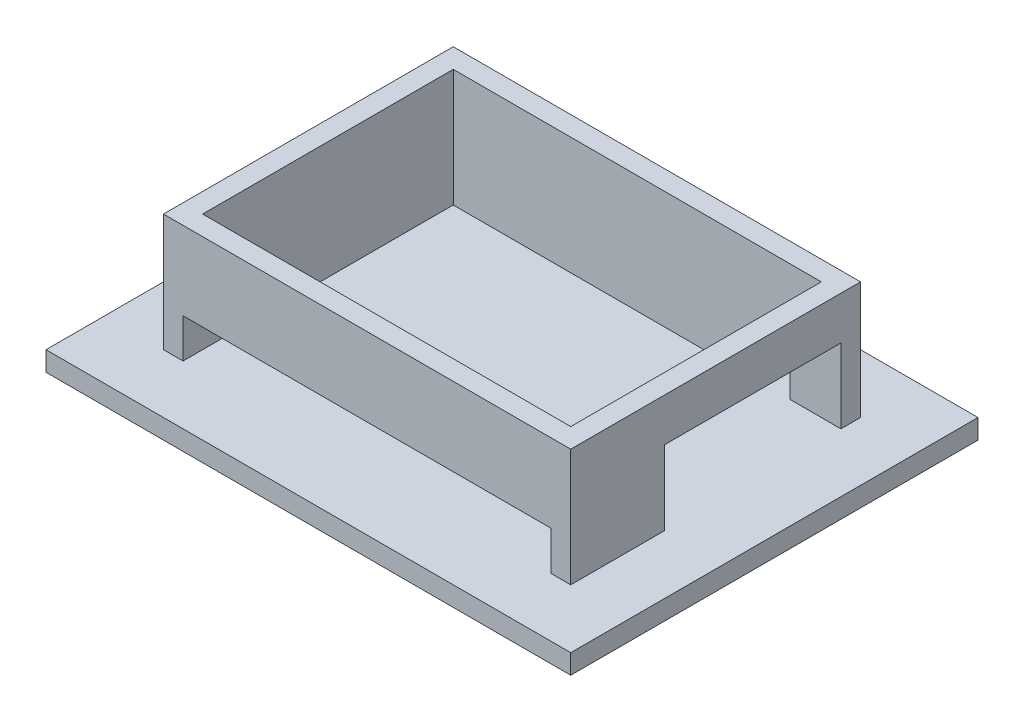
ISO-10303-21;
HEADER;
FILE_DESCRIPTION(('STEP AP214'),'2;1');
FILE_NAME('part.step','',(''),(''),'','','');
FILE_SCHEMA(('AUTOMOTIVE_DESIGN { 1 0 10303 214 1 1 1 1 }'));
ENDSEC;
DATA;
#1=APPLICATION_CONTEXT('core data for automotive mechanical design processes');
#2=APPLICATION_PROTOCOL_DEFINITION('international standard','automotive_design',2000,#1);
#3=PRODUCT_CONTEXT('',#1,'mechanical');
#4=PRODUCT('Part','Part','',(#3));
#5=PRODUCT_RELATED_PRODUCT_CATEGORY('part','',(#4));
#6=PRODUCT_DEFINITION_FORMATION('','',#4);
#7=PRODUCT_DEFINITION_CONTEXT('part definition',#1,'design');
#8=PRODUCT_DEFINITION('design','',#6,#7);
#9=PRODUCT_DEFINITION_SHAPE('','',#8);
#10=(LENGTH_UNIT() NAMED_UNIT(*) SI_UNIT(.MILLI.,.METRE.));
#11=(NAMED_UNIT(*) PLANE_ANGLE_UNIT() SI_UNIT($,.RADIAN.));
#12=(NAMED_UNIT(*) SI_UNIT($,.STERADIAN.) SOLID_ANGLE_UNIT());
#13=UNCERTAINTY_MEASURE_WITH_UNIT(LENGTH_MEASURE(1.E-05),#10,'distance_accuracy_value','');
#14=(GEOMETRIC_REPRESENTATION_CONTEXT(3) GLOBAL_UNCERTAINTY_ASSIGNED_CONTEXT((#13)) GLOBAL_UNIT_ASSIGNED_CONTEXT((#10,
#11,#12)) REPRESENTATION_CONTEXT('',''));
#15=CARTESIAN_POINT('',(0.,0.,0.));
#16=DIRECTION('',(0.,0.,1.));
#17=DIRECTION('',(1.,0.,0.));
#18=AXIS2_PLACEMENT_3D('',#15,#16,#17);
#19=CARTESIAN_POINT('',(47.,35.,-32.));
#20=DIRECTION('',(0.,0.,1.));
#21=DIRECTION('',(1.,0.,0.));
#22=AXIS2_PLACEMENT_3D('',#19,#20,#21);
#23=PLANE('',#22);
#24=DIRECTION('',(-1.,0.,0.));
#25=VECTOR('',#24,1.);
#26=CARTESIAN_POINT('',(47.,5.,-32.));
#27=LINE('',#26,#25);
#28=CARTESIAN_POINT('',(27.,5.,-32.));
#29=VERTEX_POINT('',#28);
#30=CARTESIAN_POINT('',(-47.,5.,-32.));
#31=VERTEX_POINT('',#30);
#32=EDGE_CURVE('E317',#29,#31,#27,.T.);
#33=ORIENTED_EDGE('',*,*,#32,.F.);
#34=DIRECTION('',(0.,1.,0.));
#35=VECTOR('',#34,1.);
#36=CARTESIAN_POINT('',(27.,35.,-32.));
#37=LINE('',#36,#35);
#38=CARTESIAN_POINT('',(27.,11.,-32.));
#39=VERTEX_POINT('',#38);
#40=EDGE_CURVE('E235',#29,#39,#37,.T.);
#41=ORIENTED_EDGE('',*,*,#40,.T.);
#42=DIRECTION('',(1.,0.,0.));
#43=VECTOR('',#42,1.);
#44=CARTESIAN_POINT('',(47.,11.,-32.));
#45=LINE('',#44,#43);
#46=CARTESIAN_POINT('',(39.,11.,-32.));
#47=VERTEX_POINT('',#46);
#48=EDGE_CURVE('E231',#39,#47,#45,.T.);
#49=ORIENTED_EDGE('',*,*,#48,.T.);
#50=DIRECTION('',(0.,1.,0.));
#51=VECTOR('',#50,1.);
#52=CARTESIAN_POINT('',(39.,35.,-32.));
#53=LINE('',#52,#51);
#54=CARTESIAN_POINT('',(39.,5.,-32.));
#55=VERTEX_POINT('',#54);
#56=EDGE_CURVE('E212',#55,#47,#53,.T.);
#57=ORIENTED_EDGE('',*,*,#56,.F.);
#58=CARTESIAN_POINT('',(52.,5.,-32.));
#59=VERTEX_POINT('',#58);
#60=EDGE_CURVE('E318',#59,#55,#27,.T.);
#61=ORIENTED_EDGE('',*,*,#60,.F.);
#62=DIRECTION('',(0.,1.,0.));
#63=VECTOR('',#62,1.);
#64=CARTESIAN_POINT('',(52.,-169.62311163282,-32.));
#65=LINE('',#64,#63);
#66=CARTESIAN_POINT('',(52.,24.,-32.));
#67=VERTEX_POINT('',#66);
#68=EDGE_CURVE('E268',#59,#67,#65,.T.);
#69=ORIENTED_EDGE('',*,*,#68,.T.);
#70=DIRECTION('',(1.,0.,0.));
#71=VECTOR('',#70,1.);
#72=CARTESIAN_POINT('',(-95.8466989672793,24.,-32.));
#73=LINE('',#72,#71);
#74=CARTESIAN_POINT('',(47.,24.,-32.));
#75=VERTEX_POINT('',#74);
#76=EDGE_CURVE('E253',#75,#67,#73,.T.);
#77=ORIENTED_EDGE('',*,*,#76,.F.);
#78=DIRECTION('',(0.,-1.,0.));
#79=VECTOR('',#78,1.);
#80=CARTESIAN_POINT('',(47.,35.,-32.));
#81=LINE('',#80,#79);
#82=CARTESIAN_POINT('',(47.,35.,-32.));
#83=VERTEX_POINT('',#82);
#84=EDGE_CURVE('E339',#83,#75,#81,.T.);
#85=ORIENTED_EDGE('',*,*,#84,.F.);
#86=DIRECTION('',(-1.,0.,0.));
#87=VECTOR('',#86,1.);
#88=CARTESIAN_POINT('',(47.,35.,-32.));
#89=LINE('',#88,#87);
#90=CARTESIAN_POINT('',(-47.,35.,-32.));
#91=VERTEX_POINT('',#90);
#92=EDGE_CURVE('E328',#83,#91,#89,.T.);
#93=ORIENTED_EDGE('',*,*,#92,.T.);
#94=DIRECTION('',(0.,-1.,0.));
#95=VECTOR('',#94,1.);
#96=CARTESIAN_POINT('',(-47.,35.,-32.));
#97=LINE('',#96,#95);
#98=EDGE_CURVE('E342',#91,#31,#97,.T.);
#99=ORIENTED_EDGE('',*,*,#98,.T.);
#100=EDGE_LOOP('',(#33,#41,#49,#57,#61,#69,#77,#85,#93,#99));
#101=FACE_BOUND('',#100,.T.);
#102=ADVANCED_FACE('F64',(#101),#23,.T.);
#103=CARTESIAN_POINT('',(0.,-169.62311163282,-37.));
#104=DIRECTION('',(0.,0.,-1.));
#105=DIRECTION('',(-1.,0.,0.));
#106=AXIS2_PLACEMENT_3D('',#103,#104,#105);
#107=PLANE('',#106);
#108=DIRECTION('',(-1.,0.,0.));
#109=VECTOR('',#108,1.);
#110=CARTESIAN_POINT('',(0.,11.,-37.));
#111=LINE('',#110,#109);
#112=CARTESIAN_POINT('',(39.,11.,-37.));
#113=VERTEX_POINT('',#112);
#114=CARTESIAN_POINT('',(27.,11.,-37.));
#115=VERTEX_POINT('',#114);
#116=EDGE_CURVE('E218',#113,#115,#111,.T.);
#117=ORIENTED_EDGE('',*,*,#116,.T.);
#118=DIRECTION('',(0.,-1.,0.));
#119=VECTOR('',#118,1.);
#120=CARTESIAN_POINT('',(27.,0.,-37.));
#121=LINE('',#120,#119);
#122=CARTESIAN_POINT('',(27.,5.,-37.));
#123=VERTEX_POINT('',#122);
#124=EDGE_CURVE('E87',#115,#123,#121,.T.);
#125=ORIENTED_EDGE('',*,*,#124,.T.);
#126=DIRECTION('',(-1.,0.,0.));
#127=VECTOR('',#126,1.);
#128=CARTESIAN_POINT('',(0.,5.,-37.));
#129=LINE('',#128,#127);
#130=CARTESIAN_POINT('',(-52.,5.,-37.));
#131=VERTEX_POINT('',#130);
#132=EDGE_CURVE('E280',#123,#131,#129,.T.);
#133=ORIENTED_EDGE('',*,*,#132,.T.);
#134=DIRECTION('',(0.,1.,0.));
#135=VECTOR('',#134,1.);
#136=CARTESIAN_POINT('',(-52.,-169.62311163282,-37.));
#137=LINE('',#136,#135);
#138=CARTESIAN_POINT('',(-52.,35.,-37.));
#139=VERTEX_POINT('',#138);
#140=EDGE_CURVE('E304',#131,#139,#137,.T.);
#141=ORIENTED_EDGE('',*,*,#140,.T.);
#142=DIRECTION('',(-1.,0.,0.));
#143=VECTOR('',#142,1.);
#144=CARTESIAN_POINT('',(0.,35.,-37.));
#145=LINE('',#144,#143);
#146=CARTESIAN_POINT('',(52.,35.,-37.));
#147=VERTEX_POINT('',#146);
#148=EDGE_CURVE('E296',#147,#139,#145,.T.);
#149=ORIENTED_EDGE('',*,*,#148,.F.);
#150=DIRECTION('',(0.,1.,0.));
#151=VECTOR('',#150,1.);
#152=CARTESIAN_POINT('',(52.,-169.62311163282,-37.));
#153=LINE('',#152,#151);
#154=CARTESIAN_POINT('',(52.,5.,-37.));
#155=VERTEX_POINT('',#154);
#156=EDGE_CURVE('E311',#155,#147,#153,.T.);
#157=ORIENTED_EDGE('',*,*,#156,.F.);
#158=CARTESIAN_POINT('',(39.,5.,-37.));
#159=VERTEX_POINT('',#158);
#160=EDGE_CURVE('E224',#155,#159,#129,.T.);
#161=ORIENTED_EDGE('',*,*,#160,.T.);
#162=DIRECTION('',(0.,-1.,0.));
#163=VECTOR('',#162,1.);
#164=CARTESIAN_POINT('',(39.,0.,-37.));
#165=LINE('',#164,#163);
#166=EDGE_CURVE('E209',#113,#159,#165,.T.);
#167=ORIENTED_EDGE('',*,*,#166,.F.);
#168=EDGE_LOOP('',(#117,#125,#133,#141,#149,#157,#161,#167));
#169=FACE_BOUND('',#168,.T.);
#170=ADVANCED_FACE('F222',(#169),#107,.T.);
#171=CARTESIAN_POINT('',(52.,-169.62311163282,0.));
#172=DIRECTION('',(-1.,0.,0.));
#173=DIRECTION('',(0.,0.,1.));
#174=AXIS2_PLACEMENT_3D('',#171,#172,#173);
#175=PLANE('',#174);
#176=ORIENTED_EDGE('',*,*,#68,.F.);
#177=DIRECTION('',(0.,0.,1.));
#178=VECTOR('',#177,1.);
#179=CARTESIAN_POINT('',(52.,5.,0.));
#180=LINE('',#179,#178);
#181=EDGE_CURVE('E283',#155,#59,#180,.T.);
#182=ORIENTED_EDGE('',*,*,#181,.F.);
#183=ORIENTED_EDGE('',*,*,#156,.T.);
#184=DIRECTION('',(0.,0.,1.));
#185=VECTOR('',#184,1.);
#186=CARTESIAN_POINT('',(52.,35.,0.));
#187=LINE('',#186,#185);
#188=CARTESIAN_POINT('',(52.,35.,37.));
#189=VERTEX_POINT('',#188);
#190=EDGE_CURVE('E299',#147,#189,#187,.T.);
#191=ORIENTED_EDGE('',*,*,#190,.T.);
#192=DIRECTION('',(0.,1.,0.));
#193=VECTOR('',#192,1.);
#194=CARTESIAN_POINT('',(52.,-169.62311163282,37.));
#195=LINE('',#194,#193);
#196=CARTESIAN_POINT('',(52.,5.,37.));
#197=VERTEX_POINT('',#196);
#198=EDGE_CURVE('E309',#197,#189,#195,.T.);
#199=ORIENTED_EDGE('',*,*,#198,.F.);
#200=CARTESIAN_POINT('',(52.,5.,13.));
#201=VERTEX_POINT('',#200);
#202=EDGE_CURVE('E282',#201,#197,#180,.T.);
#203=ORIENTED_EDGE('',*,*,#202,.F.);
#204=DIRECTION('',(0.,1.,0.));
#205=VECTOR('',#204,1.);
#206=CARTESIAN_POINT('',(52.,-169.62311163282,13.));
#207=LINE('',#206,#205);
#208=CARTESIAN_POINT('',(52.,24.,13.));
#209=VERTEX_POINT('',#208);
#210=EDGE_CURVE('E258',#201,#209,#207,.T.);
#211=ORIENTED_EDGE('',*,*,#210,.T.);
#212=DIRECTION('',(0.,0.,-1.));
#213=VECTOR('',#212,1.);
#214=CARTESIAN_POINT('',(52.,24.,0.));
#215=LINE('',#214,#213);
#216=EDGE_CURVE('E13',#209,#67,#215,.T.);
#217=ORIENTED_EDGE('',*,*,#216,.T.);
#218=EDGE_LOOP('',(#176,#182,#183,#191,#199,#203,#211,#217));
#219=FACE_BOUND('',#218,.T.);
#220=ADVANCED_FACE('F399',(#219),#175,.F.);
#221=CARTESIAN_POINT('',(0.,35.,0.));
#222=DIRECTION('',(0.,-1.,0.));
#223=DIRECTION('',(0.,0.,-1.));
#224=AXIS2_PLACEMENT_3D('',#221,#222,#223);
#225=PLANE('',#224);
#226=DIRECTION('',(0.,0.,1.));
#227=VECTOR('',#226,1.);
#228=CARTESIAN_POINT('',(47.,35.,-32.));
#229=LINE('',#228,#227);
#230=CARTESIAN_POINT('',(47.,35.,32.));
#231=VERTEX_POINT('',#230);
#232=EDGE_CURVE('E331',#83,#231,#229,.T.);
#233=ORIENTED_EDGE('',*,*,#232,.T.);
#234=DIRECTION('',(-1.,0.,0.));
#235=VECTOR('',#234,1.);
#236=CARTESIAN_POINT('',(47.,35.,32.));
#237=LINE('',#236,#235);
#238=CARTESIAN_POINT('',(-47.,35.,32.));
#239=VERTEX_POINT('',#238);
#240=EDGE_CURVE('E323',#231,#239,#237,.T.);
#241=ORIENTED_EDGE('',*,*,#240,.T.);
#242=DIRECTION('',(0.,0.,1.));
#243=VECTOR('',#242,1.);
#244=CARTESIAN_POINT('',(-47.,35.,-32.));
#245=LINE('',#244,#243);
#246=EDGE_CURVE('E326',#91,#239,#245,.T.);
#247=ORIENTED_EDGE('',*,*,#246,.F.);
#248=ORIENTED_EDGE('',*,*,#92,.F.);
#249=EDGE_LOOP('',(#233,#241,#247,#248));
#250=FACE_BOUND('',#249,.T.);
#251=ORIENTED_EDGE('',*,*,#148,.T.);
#252=DIRECTION('',(0.,0.,1.));
#253=VECTOR('',#252,1.);
#254=CARTESIAN_POINT('',(-52.,35.,0.));
#255=LINE('',#254,#253);
#256=CARTESIAN_POINT('',(-52.,35.,37.));
#257=VERTEX_POINT('',#256);
#258=EDGE_CURVE('E293',#139,#257,#255,.T.);
#259=ORIENTED_EDGE('',*,*,#258,.T.);
#260=DIRECTION('',(-1.,0.,0.));
#261=VECTOR('',#260,1.);
#262=CARTESIAN_POINT('',(0.,35.,37.));
#263=LINE('',#262,#261);
#264=EDGE_CURVE('E302',#189,#257,#263,.T.);
#265=ORIENTED_EDGE('',*,*,#264,.F.);
#266=ORIENTED_EDGE('',*,*,#190,.F.);
#267=EDGE_LOOP('',(#251,#259,#265,#266));
#268=FACE_BOUND('',#267,.T.);
#269=ADVANCED_FACE('F413',(#250,#268),#225,.F.);
#270=CARTESIAN_POINT('',(47.,35.,32.));
#271=DIRECTION('',(0.,0.,1.));
#272=DIRECTION('',(1.,0.,0.));
#273=AXIS2_PLACEMENT_3D('',#270,#271,#272);
#274=PLANE('',#273);
#275=DIRECTION('',(0.,-1.,0.));
#276=VECTOR('',#275,1.);
#277=CARTESIAN_POINT('',(47.,35.,32.));
#278=LINE('',#277,#276);
#279=CARTESIAN_POINT('',(47.,15.,32.));
#280=VERTEX_POINT('',#279);
#281=EDGE_CURVE('E335',#231,#280,#278,.T.);
#282=ORIENTED_EDGE('',*,*,#281,.T.);
#283=DIRECTION('',(-1.,0.,0.));
#284=VECTOR('',#283,1.);
#285=CARTESIAN_POINT('',(-47.,15.,32.));
#286=LINE('',#285,#284);
#287=CARTESIAN_POINT('',(-47.,15.,32.));
#288=VERTEX_POINT('',#287);
#289=EDGE_CURVE('E239',#280,#288,#286,.T.);
#290=ORIENTED_EDGE('',*,*,#289,.T.);
#291=DIRECTION('',(0.,-1.,0.));
#292=VECTOR('',#291,1.);
#293=CARTESIAN_POINT('',(-47.,35.,32.));
#294=LINE('',#293,#292);
#295=EDGE_CURVE('E334',#239,#288,#294,.T.);
#296=ORIENTED_EDGE('',*,*,#295,.F.);
#297=ORIENTED_EDGE('',*,*,#240,.F.);
#298=EDGE_LOOP('',(#282,#290,#296,#297));
#299=FACE_BOUND('',#298,.T.);
#300=ADVANCED_FACE('F410',(#299),#274,.F.);
#301=CARTESIAN_POINT('',(47.,35.,-32.));
#302=DIRECTION('',(1.,0.,0.));
#303=DIRECTION('',(0.,0.,-1.));
#304=AXIS2_PLACEMENT_3D('',#301,#302,#303);
#305=PLANE('',#304);
#306=DIRECTION('',(0.,0.,1.));
#307=VECTOR('',#306,1.);
#308=CARTESIAN_POINT('',(47.,24.,-32.));
#309=LINE('',#308,#307);
#310=CARTESIAN_POINT('',(47.,24.,13.));
#311=VERTEX_POINT('',#310);
#312=EDGE_CURVE('E271',#75,#311,#309,.T.);
#313=ORIENTED_EDGE('',*,*,#312,.T.);
#314=DIRECTION('',(0.,-1.,0.));
#315=VECTOR('',#314,1.);
#316=CARTESIAN_POINT('',(47.,35.,13.));
#317=LINE('',#316,#315);
#318=CARTESIAN_POINT('',(47.,5.,13.));
#319=VERTEX_POINT('',#318);
#320=EDGE_CURVE('E265',#311,#319,#317,.T.);
#321=ORIENTED_EDGE('',*,*,#320,.T.);
#322=DIRECTION('',(0.,0.,1.));
#323=VECTOR('',#322,1.);
#324=CARTESIAN_POINT('',(47.,5.,-32.));
#325=LINE('',#324,#323);
#326=CARTESIAN_POINT('',(47.,5.,37.));
#327=VERTEX_POINT('',#326);
#328=EDGE_CURVE('E321',#319,#327,#325,.T.);
#329=ORIENTED_EDGE('',*,*,#328,.T.);
#330=DIRECTION('',(0.,1.,0.));
#331=VECTOR('',#330,1.);
#332=CARTESIAN_POINT('',(47.,15.,37.));
#333=LINE('',#332,#331);
#334=CARTESIAN_POINT('',(47.,15.,37.));
#335=VERTEX_POINT('',#334);
#336=EDGE_CURVE('E246',#327,#335,#333,.T.);
#337=ORIENTED_EDGE('',*,*,#336,.T.);
#338=DIRECTION('',(0.,0.,1.));
#339=VECTOR('',#338,1.);
#340=CARTESIAN_POINT('',(47.,15.,32.));
#341=LINE('',#340,#339);
#342=EDGE_CURVE('E242',#280,#335,#341,.T.);
#343=ORIENTED_EDGE('',*,*,#342,.F.);
#344=ORIENTED_EDGE('',*,*,#281,.F.);
#345=ORIENTED_EDGE('',*,*,#232,.F.);
#346=ORIENTED_EDGE('',*,*,#84,.T.);
#347=EDGE_LOOP('',(#313,#321,#329,#337,#343,#344,#345,#346));
#348=FACE_BOUND('',#347,.T.);
#349=ADVANCED_FACE('F404',(#348),#305,.F.);
#350=CARTESIAN_POINT('',(-47.,35.,-32.));
#351=DIRECTION('',(1.,0.,0.));
#352=DIRECTION('',(0.,0.,-1.));
#353=AXIS2_PLACEMENT_3D('',#350,#351,#352);
#354=PLANE('',#353);
#355=ORIENTED_EDGE('',*,*,#295,.T.);
#356=DIRECTION('',(0.,0.,1.));
#357=VECTOR('',#356,1.);
#358=CARTESIAN_POINT('',(-47.,15.,32.));
#359=LINE('',#358,#357);
#360=CARTESIAN_POINT('',(-47.,15.,37.));
#361=VERTEX_POINT('',#360);
#362=EDGE_CURVE('E251',#288,#361,#359,.T.);
#363=ORIENTED_EDGE('',*,*,#362,.T.);
#364=DIRECTION('',(0.,-1.,0.));
#365=VECTOR('',#364,1.);
#366=CARTESIAN_POINT('',(-47.,15.,37.));
#367=LINE('',#366,#365);
#368=CARTESIAN_POINT('',(-47.,5.,37.));
#369=VERTEX_POINT('',#368);
#370=EDGE_CURVE('E238',#361,#369,#367,.T.);
#371=ORIENTED_EDGE('',*,*,#370,.T.);
#372=DIRECTION('',(0.,0.,1.));
#373=VECTOR('',#372,1.);
#374=CARTESIAN_POINT('',(-47.,5.,-32.));
#375=LINE('',#374,#373);
#376=EDGE_CURVE('E315',#31,#369,#375,.T.);
#377=ORIENTED_EDGE('',*,*,#376,.F.);
#378=ORIENTED_EDGE('',*,*,#98,.F.);
#379=ORIENTED_EDGE('',*,*,#246,.T.);
#380=EDGE_LOOP('',(#355,#363,#371,#377,#378,#379));
#381=FACE_BOUND('',#380,.T.);
#382=ADVANCED_FACE('F406',(#381),#354,.T.);
#383=CARTESIAN_POINT('',(0.,5.,0.));
#384=DIRECTION('',(0.,1.,0.));
#385=DIRECTION('',(0.,0.,1.));
#386=AXIS2_PLACEMENT_3D('',#383,#384,#385);
#387=PLANE('',#386);
#388=ORIENTED_EDGE('',*,*,#60,.T.);
#389=DIRECTION('',(0.,0.,-1.));
#390=VECTOR('',#389,1.);
#391=CARTESIAN_POINT('',(39.,5.,-27.));
#392=LINE('',#391,#390);
#393=EDGE_CURVE('E214',#55,#159,#392,.T.);
#394=ORIENTED_EDGE('',*,*,#393,.T.);
#395=ORIENTED_EDGE('',*,*,#160,.F.);
#396=ORIENTED_EDGE('',*,*,#181,.T.);
#397=EDGE_LOOP('',(#388,#394,#395,#396));
#398=FACE_BOUND('',#397,.T.);
#399=DIRECTION('',(0.,0.,-1.));
#400=VECTOR('',#399,1.);
#401=CARTESIAN_POINT('',(27.,5.,-27.));
#402=LINE('',#401,#400);
#403=EDGE_CURVE('E229',#29,#123,#402,.T.);
#404=ORIENTED_EDGE('',*,*,#403,.F.);
#405=ORIENTED_EDGE('',*,*,#32,.T.);
#406=ORIENTED_EDGE('',*,*,#376,.T.);
#407=DIRECTION('',(-1.,0.,0.));
#408=VECTOR('',#407,1.);
#409=CARTESIAN_POINT('',(0.,5.,37.));
#410=LINE('',#409,#408);
#411=CARTESIAN_POINT('',(-52.,5.,37.));
#412=VERTEX_POINT('',#411);
#413=EDGE_CURVE('E286',#369,#412,#410,.T.);
#414=ORIENTED_EDGE('',*,*,#413,.T.);
#415=DIRECTION('',(0.,0.,1.));
#416=VECTOR('',#415,1.);
#417=CARTESIAN_POINT('',(-52.,5.,0.));
#418=LINE('',#417,#416);
#419=EDGE_CURVE('E290',#131,#412,#418,.T.);
#420=ORIENTED_EDGE('',*,*,#419,.F.);
#421=ORIENTED_EDGE('',*,*,#132,.F.);
#422=EDGE_LOOP('',(#404,#405,#406,#414,#420,#421));
#423=FACE_BOUND('',#422,.T.);
#424=ORIENTED_EDGE('',*,*,#328,.F.);
#425=DIRECTION('',(1.,0.,0.));
#426=VECTOR('',#425,1.);
#427=CARTESIAN_POINT('',(-95.8466989672793,5.,13.));
#428=LINE('',#427,#426);
#429=EDGE_CURVE('E255',#319,#201,#428,.T.);
#430=ORIENTED_EDGE('',*,*,#429,.T.);
#431=ORIENTED_EDGE('',*,*,#202,.T.);
#432=EDGE_CURVE('E287',#197,#327,#410,.T.);
#433=ORIENTED_EDGE('',*,*,#432,.T.);
#434=EDGE_LOOP('',(#424,#430,#431,#433));
#435=FACE_BOUND('',#434,.T.);
#436=DIRECTION('',(0.,0.,-1.));
#437=VECTOR('',#436,1.);
#438=CARTESIAN_POINT('',(67.,5.,0.));
#439=LINE('',#438,#437);
#440=CARTESIAN_POINT('',(67.,5.,52.));
#441=VERTEX_POINT('',#440);
#442=CARTESIAN_POINT('',(67.,5.,-52.));
#443=VERTEX_POINT('',#442);
#444=EDGE_CURVE('E274',#441,#443,#439,.T.);
#445=ORIENTED_EDGE('',*,*,#444,.T.);
#446=DIRECTION('',(-1.,0.,0.));
#447=VECTOR('',#446,1.);
#448=CARTESIAN_POINT('',(0.,5.,-52.));
#449=LINE('',#448,#447);
#450=CARTESIAN_POINT('',(-67.,5.,-52.));
#451=VERTEX_POINT('',#450);
#452=EDGE_CURVE('E276',#443,#451,#449,.T.);
#453=ORIENTED_EDGE('',*,*,#452,.T.);
#454=DIRECTION('',(0.,0.,1.));
#455=VECTOR('',#454,1.);
#456=CARTESIAN_POINT('',(-67.,5.,0.));
#457=LINE('',#456,#455);
#458=CARTESIAN_POINT('',(-67.,5.,52.));
#459=VERTEX_POINT('',#458);
#460=EDGE_CURVE('E278',#451,#459,#457,.T.);
#461=ORIENTED_EDGE('',*,*,#460,.T.);
#462=DIRECTION('',(1.,0.,0.));
#463=VECTOR('',#462,1.);
#464=CARTESIAN_POINT('',(0.,5.,52.));
#465=LINE('',#464,#463);
#466=EDGE_CURVE('E308',#459,#441,#465,.T.);
#467=ORIENTED_EDGE('',*,*,#466,.T.);
#468=EDGE_LOOP('',(#445,#453,#461,#467));
#469=FACE_BOUND('',#468,.T.);
#470=ADVANCED_FACE('F383',(#398,#423,#435,#469),#387,.T.);
#471=CARTESIAN_POINT('',(0.,-169.62311163282,37.));
#472=DIRECTION('',(0.,0.,-1.));
#473=DIRECTION('',(-1.,0.,0.));
#474=AXIS2_PLACEMENT_3D('',#471,#472,#473);
#475=PLANE('',#474);
#476=ORIENTED_EDGE('',*,*,#413,.F.);
#477=ORIENTED_EDGE('',*,*,#370,.F.);
#478=DIRECTION('',(-1.,0.,0.));
#479=VECTOR('',#478,1.);
#480=CARTESIAN_POINT('',(-47.,15.,37.));
#481=LINE('',#480,#479);
#482=EDGE_CURVE('E243',#335,#361,#481,.T.);
#483=ORIENTED_EDGE('',*,*,#482,.F.);
#484=ORIENTED_EDGE('',*,*,#336,.F.);
#485=ORIENTED_EDGE('',*,*,#432,.F.);
#486=ORIENTED_EDGE('',*,*,#198,.T.);
#487=ORIENTED_EDGE('',*,*,#264,.T.);
#488=DIRECTION('',(0.,1.,0.));
#489=VECTOR('',#488,1.);
#490=CARTESIAN_POINT('',(-52.,-169.62311163282,37.));
#491=LINE('',#490,#489);
#492=EDGE_CURVE('E305',#412,#257,#491,.T.);
#493=ORIENTED_EDGE('',*,*,#492,.F.);
#494=EDGE_LOOP('',(#476,#477,#483,#484,#485,#486,#487,#493));
#495=FACE_BOUND('',#494,.T.);
#496=ADVANCED_FACE('F423',(#495),#475,.F.);
#497=CARTESIAN_POINT('',(-52.,-169.62311163282,0.));
#498=DIRECTION('',(-1.,0.,0.));
#499=DIRECTION('',(0.,0.,1.));
#500=AXIS2_PLACEMENT_3D('',#497,#498,#499);
#501=PLANE('',#500);
#502=ORIENTED_EDGE('',*,*,#419,.T.);
#503=ORIENTED_EDGE('',*,*,#492,.T.);
#504=ORIENTED_EDGE('',*,*,#258,.F.);
#505=ORIENTED_EDGE('',*,*,#140,.F.);
#506=EDGE_LOOP('',(#502,#503,#504,#505));
#507=FACE_BOUND('',#506,.T.);
#508=ADVANCED_FACE('F419',(#507),#501,.T.);
#509=CARTESIAN_POINT('',(0.,0.,0.));
#510=DIRECTION('',(0.,-1.,0.));
#511=DIRECTION('',(0.,0.,-1.));
#512=AXIS2_PLACEMENT_3D('',#509,#510,#511);
#513=PLANE('',#512);
#514=DIRECTION('',(-1.,0.,0.));
#515=VECTOR('',#514,1.);
#516=CARTESIAN_POINT('',(67.,0.,52.));
#517=LINE('',#516,#515);
#518=CARTESIAN_POINT('',(67.,0.,52.));
#519=VERTEX_POINT('',#518);
#520=CARTESIAN_POINT('',(-67.,0.,52.));
#521=VERTEX_POINT('',#520);
#522=EDGE_CURVE('E338',#519,#521,#517,.T.);
#523=ORIENTED_EDGE('',*,*,#522,.T.);
#524=DIRECTION('',(0.,0.,-1.));
#525=VECTOR('',#524,1.);
#526=CARTESIAN_POINT('',(-67.,0.,52.));
#527=LINE('',#526,#525);
#528=CARTESIAN_POINT('',(-67.,0.,-52.));
#529=VERTEX_POINT('',#528);
#530=EDGE_CURVE('E349',#521,#529,#527,.T.);
#531=ORIENTED_EDGE('',*,*,#530,.T.);
#532=DIRECTION('',(1.,0.,0.));
#533=VECTOR('',#532,1.);
#534=CARTESIAN_POINT('',(-67.,0.,-52.));
#535=LINE('',#534,#533);
#536=CARTESIAN_POINT('',(67.,0.,-52.));
#537=VERTEX_POINT('',#536);
#538=EDGE_CURVE('E352',#529,#537,#535,.T.);
#539=ORIENTED_EDGE('',*,*,#538,.T.);
#540=DIRECTION('',(0.,0.,1.));
#541=VECTOR('',#540,1.);
#542=CARTESIAN_POINT('',(67.,0.,-52.));
#543=LINE('',#542,#541);
#544=EDGE_CURVE('E355',#537,#519,#543,.T.);
#545=ORIENTED_EDGE('',*,*,#544,.T.);
#546=EDGE_LOOP('',(#523,#531,#539,#545));
#547=FACE_BOUND('',#546,.T.);
#548=ADVANCED_FACE('F375',(#547),#513,.T.);
#549=CARTESIAN_POINT('',(-67.,35.,52.));
#550=DIRECTION('',(-1.,0.,0.));
#551=DIRECTION('',(0.,0.,1.));
#552=AXIS2_PLACEMENT_3D('',#549,#550,#551);
#553=PLANE('',#552);
#554=ORIENTED_EDGE('',*,*,#460,.F.);
#555=DIRECTION('',(0.,-1.,0.));
#556=VECTOR('',#555,1.);
#557=CARTESIAN_POINT('',(-67.,35.,-52.));
#558=LINE('',#557,#556);
#559=EDGE_CURVE('E362',#451,#529,#558,.T.);
#560=ORIENTED_EDGE('',*,*,#559,.T.);
#561=ORIENTED_EDGE('',*,*,#530,.F.);
#562=DIRECTION('',(0.,-1.,0.));
#563=VECTOR('',#562,1.);
#564=CARTESIAN_POINT('',(-67.,35.,52.));
#565=LINE('',#564,#563);
#566=EDGE_CURVE('E358',#459,#521,#565,.T.);
#567=ORIENTED_EDGE('',*,*,#566,.F.);
#568=EDGE_LOOP('',(#554,#560,#561,#567));
#569=FACE_BOUND('',#568,.T.);
#570=ADVANCED_FACE('F371',(#569),#553,.T.);
#571=CARTESIAN_POINT('',(-67.,35.,-52.));
#572=DIRECTION('',(0.,0.,-1.));
#573=DIRECTION('',(-1.,0.,0.));
#574=AXIS2_PLACEMENT_3D('',#571,#572,#573);
#575=PLANE('',#574);
#576=ORIENTED_EDGE('',*,*,#452,.F.);
#577=DIRECTION('',(0.,-1.,0.));
#578=VECTOR('',#577,1.);
#579=CARTESIAN_POINT('',(67.,35.,-52.));
#580=LINE('',#579,#578);
#581=EDGE_CURVE('E360',#443,#537,#580,.T.);
#582=ORIENTED_EDGE('',*,*,#581,.T.);
#583=ORIENTED_EDGE('',*,*,#538,.F.);
#584=ORIENTED_EDGE('',*,*,#559,.F.);
#585=EDGE_LOOP('',(#576,#582,#583,#584));
#586=FACE_BOUND('',#585,.T.);
#587=ADVANCED_FACE('F385',(#586),#575,.T.);
#588=CARTESIAN_POINT('',(67.,35.,-52.));
#589=DIRECTION('',(1.,0.,0.));
#590=DIRECTION('',(0.,0.,-1.));
#591=AXIS2_PLACEMENT_3D('',#588,#589,#590);
#592=PLANE('',#591);
#593=ORIENTED_EDGE('',*,*,#444,.F.);
#594=DIRECTION('',(0.,-1.,0.));
#595=VECTOR('',#594,1.);
#596=CARTESIAN_POINT('',(67.,35.,52.));
#597=LINE('',#596,#595);
#598=EDGE_CURVE('E72',#441,#519,#597,.T.);
#599=ORIENTED_EDGE('',*,*,#598,.T.);
#600=ORIENTED_EDGE('',*,*,#544,.F.);
#601=ORIENTED_EDGE('',*,*,#581,.F.);
#602=EDGE_LOOP('',(#593,#599,#600,#601));
#603=FACE_BOUND('',#602,.T.);
#604=ADVANCED_FACE('F380',(#603),#592,.T.);
#605=CARTESIAN_POINT('',(67.,35.,52.));
#606=DIRECTION('',(0.,0.,1.));
#607=DIRECTION('',(1.,0.,0.));
#608=AXIS2_PLACEMENT_3D('',#605,#606,#607);
#609=PLANE('',#608);
#610=ORIENTED_EDGE('',*,*,#466,.F.);
#611=ORIENTED_EDGE('',*,*,#566,.T.);
#612=ORIENTED_EDGE('',*,*,#522,.F.);
#613=ORIENTED_EDGE('',*,*,#598,.F.);
#614=EDGE_LOOP('',(#610,#611,#612,#613));
#615=FACE_BOUND('',#614,.T.);
#616=ADVANCED_FACE('F66',(#615),#609,.T.);
#617=CARTESIAN_POINT('',(-95.8466989672793,24.,0.));
#618=DIRECTION('',(0.,1.,0.));
#619=DIRECTION('',(0.,0.,1.));
#620=AXIS2_PLACEMENT_3D('',#617,#618,#619);
#621=PLANE('',#620);
#622=ORIENTED_EDGE('',*,*,#76,.T.);
#623=ORIENTED_EDGE('',*,*,#216,.F.);
#624=DIRECTION('',(1.,0.,0.));
#625=VECTOR('',#624,1.);
#626=CARTESIAN_POINT('',(-95.8466989672793,24.,13.));
#627=LINE('',#626,#625);
#628=EDGE_CURVE('E259',#311,#209,#627,.T.);
#629=ORIENTED_EDGE('',*,*,#628,.F.);
#630=ORIENTED_EDGE('',*,*,#312,.F.);
#631=EDGE_LOOP('',(#622,#623,#629,#630));
#632=FACE_BOUND('',#631,.T.);
#633=ADVANCED_FACE('F461',(#632),#621,.F.);
#634=CARTESIAN_POINT('',(-95.8466989672793,0.,13.));
#635=DIRECTION('',(0.,0.,1.));
#636=DIRECTION('',(1.,0.,0.));
#637=AXIS2_PLACEMENT_3D('',#634,#635,#636);
#638=PLANE('',#637);
#639=ORIENTED_EDGE('',*,*,#628,.T.);
#640=ORIENTED_EDGE('',*,*,#210,.F.);
#641=ORIENTED_EDGE('',*,*,#429,.F.);
#642=ORIENTED_EDGE('',*,*,#320,.F.);
#643=EDGE_LOOP('',(#639,#640,#641,#642));
#644=FACE_BOUND('',#643,.T.);
#645=ADVANCED_FACE('F463',(#644),#638,.F.);
#646=CARTESIAN_POINT('',(-47.,15.,32.));
#647=DIRECTION('',(0.,1.,0.));
#648=DIRECTION('',(0.,0.,1.));
#649=AXIS2_PLACEMENT_3D('',#646,#647,#648);
#650=PLANE('',#649);
#651=ORIENTED_EDGE('',*,*,#482,.T.);
#652=ORIENTED_EDGE('',*,*,#362,.F.);
#653=ORIENTED_EDGE('',*,*,#289,.F.);
#654=ORIENTED_EDGE('',*,*,#342,.T.);
#655=EDGE_LOOP('',(#651,#652,#653,#654));
#656=FACE_BOUND('',#655,.T.);
#657=ADVANCED_FACE('F450',(#656),#650,.F.);
#658=CARTESIAN_POINT('',(27.,0.,-27.));
#659=DIRECTION('',(1.,0.,0.));
#660=DIRECTION('',(0.,0.,-1.));
#661=AXIS2_PLACEMENT_3D('',#658,#659,#660);
#662=PLANE('',#661);
#663=ORIENTED_EDGE('',*,*,#403,.T.);
#664=ORIENTED_EDGE('',*,*,#124,.F.);
#665=DIRECTION('',(0.,0.,-1.));
#666=VECTOR('',#665,1.);
#667=CARTESIAN_POINT('',(27.,11.,-27.));
#668=LINE('',#667,#666);
#669=EDGE_CURVE('E215',#39,#115,#668,.T.);
#670=ORIENTED_EDGE('',*,*,#669,.F.);
#671=ORIENTED_EDGE('',*,*,#40,.F.);
#672=EDGE_LOOP('',(#663,#664,#670,#671));
#673=FACE_BOUND('',#672,.T.);
#674=ADVANCED_FACE('F474',(#673),#662,.T.);
#675=CARTESIAN_POINT('',(39.,0.,-27.));
#676=DIRECTION('',(1.,0.,0.));
#677=DIRECTION('',(0.,0.,-1.));
#678=AXIS2_PLACEMENT_3D('',#675,#676,#677);
#679=PLANE('',#678);
#680=ORIENTED_EDGE('',*,*,#56,.T.);
#681=DIRECTION('',(0.,0.,-1.));
#682=VECTOR('',#681,1.);
#683=CARTESIAN_POINT('',(39.,11.,-27.));
#684=LINE('',#683,#682);
#685=EDGE_CURVE('E79',#47,#113,#684,.T.);
#686=ORIENTED_EDGE('',*,*,#685,.T.);
#687=ORIENTED_EDGE('',*,*,#166,.T.);
#688=ORIENTED_EDGE('',*,*,#393,.F.);
#689=EDGE_LOOP('',(#680,#686,#687,#688));
#690=FACE_BOUND('',#689,.T.);
#691=ADVANCED_FACE('F207',(#690),#679,.F.);
#692=CARTESIAN_POINT('',(0.,11.,-27.));
#693=DIRECTION('',(0.,-1.,0.));
#694=DIRECTION('',(1.,0.,0.));
#695=AXIS2_PLACEMENT_3D('',#692,#693,#694);
#696=PLANE('',#695);
#697=ORIENTED_EDGE('',*,*,#669,.T.);
#698=ORIENTED_EDGE('',*,*,#116,.F.);
#699=ORIENTED_EDGE('',*,*,#685,.F.);
#700=ORIENTED_EDGE('',*,*,#48,.F.);
#701=EDGE_LOOP('',(#697,#698,#699,#700));
#702=FACE_BOUND('',#701,.T.);
#703=ADVANCED_FACE('F219',(#702),#696,.T.);
#704=CLOSED_SHELL('',(#102,#170,#220,#269,#300,#349,#382,#470,#496,#508,#548,#570,#587,#604,
#616,#633,#645,#657,#674,#691,#703));
#705=MANIFOLD_SOLID_BREP('B2',#704);
#706=ADVANCED_BREP_SHAPE_REPRESENTATION('',(#18,#705),#14);
#707=SHAPE_DEFINITION_REPRESENTATION(#9,#706);
ENDSEC;
END-ISO-10303-21;
